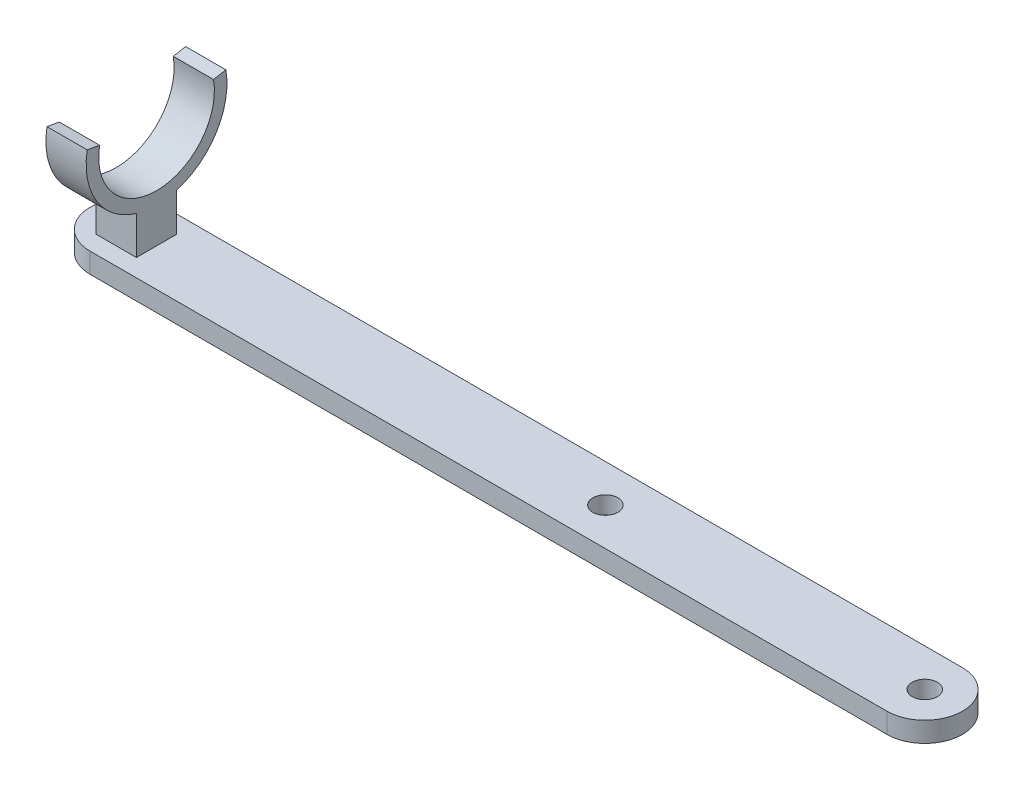
ISO-10303-21;
HEADER;
FILE_DESCRIPTION(('STEP AP214'),'2;1');
FILE_NAME('part.step','',(''),(''),'','','');
FILE_SCHEMA(('AUTOMOTIVE_DESIGN { 1 0 10303 214 1 1 1 1 }'));
ENDSEC;
DATA;
#1=APPLICATION_CONTEXT('core data for automotive mechanical design processes');
#2=APPLICATION_PROTOCOL_DEFINITION('international standard','automotive_design',2000,#1);
#3=PRODUCT_CONTEXT('',#1,'mechanical');
#4=PRODUCT('Part','Part','',(#3));
#5=PRODUCT_RELATED_PRODUCT_CATEGORY('part','',(#4));
#6=PRODUCT_DEFINITION_FORMATION('','',#4);
#7=PRODUCT_DEFINITION_CONTEXT('part definition',#1,'design');
#8=PRODUCT_DEFINITION('design','',#6,#7);
#9=PRODUCT_DEFINITION_SHAPE('','',#8);
#10=(LENGTH_UNIT() NAMED_UNIT(*) SI_UNIT(.MILLI.,.METRE.));
#11=(NAMED_UNIT(*) PLANE_ANGLE_UNIT() SI_UNIT($,.RADIAN.));
#12=(NAMED_UNIT(*) SI_UNIT($,.STERADIAN.) SOLID_ANGLE_UNIT());
#13=UNCERTAINTY_MEASURE_WITH_UNIT(LENGTH_MEASURE(1.E-05),#10,'distance_accuracy_value','');
#14=(GEOMETRIC_REPRESENTATION_CONTEXT(3) GLOBAL_UNCERTAINTY_ASSIGNED_CONTEXT((#13)) GLOBAL_UNIT_ASSIGNED_CONTEXT((#10,
#11,#12)) REPRESENTATION_CONTEXT('',''));
#15=CARTESIAN_POINT('',(0.,0.,0.));
#16=DIRECTION('',(0.,0.,1.));
#17=DIRECTION('',(1.,0.,0.));
#18=AXIS2_PLACEMENT_3D('',#15,#16,#17);
#19=CARTESIAN_POINT('',(-31.75,4.,0.));
#20=DIRECTION('',(0.,-1.,0.));
#21=DIRECTION('',(0.,0.,-1.));
#22=AXIS2_PLACEMENT_3D('',#19,#20,#21);
#23=CYLINDRICAL_SURFACE('',#22,2.5);
#24=CARTESIAN_POINT('',(-31.75,4.,0.));
#25=DIRECTION('',(0.,1.,0.));
#26=DIRECTION('',(0.,0.,1.));
#27=AXIS2_PLACEMENT_3D('',#24,#25,#26);
#28=CIRCLE('',#27,2.5);
#29=CARTESIAN_POINT('',(-31.75,4.,2.5));
#30=VERTEX_POINT('',#29);
#31=EDGE_CURVE('E241',#30,#30,#28,.T.);
#32=ORIENTED_EDGE('',*,*,#31,.T.);
#33=EDGE_LOOP('',(#32));
#34=FACE_BOUND('',#33,.T.);
#35=CARTESIAN_POINT('',(-31.75,0.5,0.));
#36=DIRECTION('',(0.,-1.,0.));
#37=DIRECTION('',(0.,0.,-1.));
#38=AXIS2_PLACEMENT_3D('',#35,#36,#37);
#39=CIRCLE('',#38,2.5);
#40=CARTESIAN_POINT('',(-31.75,0.5,-2.5));
#41=VERTEX_POINT('',#40);
#42=EDGE_CURVE('E43',#41,#41,#39,.T.);
#43=ORIENTED_EDGE('',*,*,#42,.T.);
#44=EDGE_LOOP('',(#43));
#45=FACE_BOUND('',#44,.T.);
#46=ADVANCED_FACE('F39',(#34,#45),#23,.F.);
#47=CARTESIAN_POINT('',(31.75,4.,0.));
#48=DIRECTION('',(0.,-1.,0.));
#49=DIRECTION('',(0.,0.,-1.));
#50=AXIS2_PLACEMENT_3D('',#47,#48,#49);
#51=CYLINDRICAL_SURFACE('',#50,2.5);
#52=CARTESIAN_POINT('',(31.75,4.,0.));
#53=DIRECTION('',(0.,1.,0.));
#54=DIRECTION('',(0.,0.,1.));
#55=AXIS2_PLACEMENT_3D('',#52,#53,#54);
#56=CIRCLE('',#55,2.5);
#57=CARTESIAN_POINT('',(31.75,4.,2.49999999999999));
#58=VERTEX_POINT('',#57);
#59=EDGE_CURVE('E208',#58,#58,#56,.T.);
#60=ORIENTED_EDGE('',*,*,#59,.T.);
#61=EDGE_LOOP('',(#60));
#62=FACE_BOUND('',#61,.T.);
#63=CARTESIAN_POINT('',(31.75,0.5,0.));
#64=DIRECTION('',(0.,-1.,0.));
#65=DIRECTION('',(0.,0.,-1.));
#66=AXIS2_PLACEMENT_3D('',#63,#64,#65);
#67=CIRCLE('',#66,2.5);
#68=CARTESIAN_POINT('',(31.75,0.5,-2.50000000000001));
#69=VERTEX_POINT('',#68);
#70=EDGE_CURVE('E172',#69,#69,#67,.T.);
#71=ORIENTED_EDGE('',*,*,#70,.T.);
#72=EDGE_LOOP('',(#71));
#73=FACE_BOUND('',#72,.T.);
#74=ADVANCED_FACE('F324',(#62,#73),#51,.F.);
#75=CARTESIAN_POINT('',(-126.75,4.,0.));
#76=DIRECTION('',(0.,1.,0.));
#77=DIRECTION('',(0.,0.,1.));
#78=AXIS2_PLACEMENT_3D('',#75,#76,#77);
#79=PLANE('',#78);
#80=ORIENTED_EDGE('',*,*,#31,.F.);
#81=EDGE_LOOP('',(#80));
#82=FACE_BOUND('',#81,.T.);
#83=CARTESIAN_POINT('',(-126.75,4.,0.));
#84=DIRECTION('',(0.,1.,0.));
#85=DIRECTION('',(0.,0.,1.));
#86=AXIS2_PLACEMENT_3D('',#83,#84,#85);
#87=CIRCLE('',#86,7.5);
#88=CARTESIAN_POINT('',(-126.75,4.,-7.49999999999999));
#89=VERTEX_POINT('',#88);
#90=CARTESIAN_POINT('',(-126.75,4.,7.50000000000001));
#91=VERTEX_POINT('',#90);
#92=EDGE_CURVE('E246',#89,#91,#87,.T.);
#93=ORIENTED_EDGE('',*,*,#92,.T.);
#94=DIRECTION('',(1.,0.,0.));
#95=VECTOR('',#94,1.);
#96=CARTESIAN_POINT('',(-126.75,4.,7.50000000000001));
#97=LINE('',#96,#95);
#98=CARTESIAN_POINT('',(31.75,4.,7.49999999999999));
#99=VERTEX_POINT('',#98);
#100=EDGE_CURVE('E94',#91,#99,#97,.T.);
#101=ORIENTED_EDGE('',*,*,#100,.T.);
#102=CARTESIAN_POINT('',(31.75,4.,0.));
#103=DIRECTION('',(0.,1.,0.));
#104=DIRECTION('',(0.,0.,1.));
#105=AXIS2_PLACEMENT_3D('',#102,#103,#104);
#106=CIRCLE('',#105,7.5);
#107=CARTESIAN_POINT('',(31.75,4.,-7.49999999999999));
#108=VERTEX_POINT('',#107);
#109=EDGE_CURVE('E251',#99,#108,#106,.T.);
#110=ORIENTED_EDGE('',*,*,#109,.T.);
#111=DIRECTION('',(-1.,0.,0.));
#112=VECTOR('',#111,1.);
#113=CARTESIAN_POINT('',(-126.75,4.,-7.49999999999999));
#114=LINE('',#113,#112);
#115=EDGE_CURVE('E66',#108,#89,#114,.T.);
#116=ORIENTED_EDGE('',*,*,#115,.T.);
#117=EDGE_LOOP('',(#93,#101,#110,#116));
#118=FACE_BOUND('',#117,.T.);
#119=ORIENTED_EDGE('',*,*,#59,.F.);
#120=EDGE_LOOP('',(#119));
#121=FACE_BOUND('',#120,.T.);
#122=DIRECTION('',(0.,0.,1.));
#123=VECTOR('',#122,1.);
#124=CARTESIAN_POINT('',(-129.,4.,4.00000000000001));
#125=LINE('',#124,#123);
#126=CARTESIAN_POINT('',(-129.,4.,-3.99999999999999));
#127=VERTEX_POINT('',#126);
#128=CARTESIAN_POINT('',(-129.,4.,4.00000000000001));
#129=VERTEX_POINT('',#128);
#130=EDGE_CURVE('E197',#127,#129,#125,.T.);
#131=ORIENTED_EDGE('',*,*,#130,.F.);
#132=DIRECTION('',(-1.,0.,0.));
#133=VECTOR('',#132,1.);
#134=CARTESIAN_POINT('',(-129.,4.,-3.99999999999999));
#135=LINE('',#134,#133);
#136=CARTESIAN_POINT('',(-121.,4.,-3.99999999999999));
#137=VERTEX_POINT('',#136);
#138=EDGE_CURVE('E57',#137,#127,#135,.T.);
#139=ORIENTED_EDGE('',*,*,#138,.F.);
#140=DIRECTION('',(0.,0.,-1.));
#141=VECTOR('',#140,1.);
#142=CARTESIAN_POINT('',(-121.,4.,4.00000000000001));
#143=LINE('',#142,#141);
#144=CARTESIAN_POINT('',(-121.,4.,4.00000000000001));
#145=VERTEX_POINT('',#144);
#146=EDGE_CURVE('E217',#145,#137,#143,.T.);
#147=ORIENTED_EDGE('',*,*,#146,.F.);
#148=DIRECTION('',(1.,0.,0.));
#149=VECTOR('',#148,1.);
#150=CARTESIAN_POINT('',(-129.,4.,4.00000000000001));
#151=LINE('',#150,#149);
#152=EDGE_CURVE('E213',#129,#145,#151,.T.);
#153=ORIENTED_EDGE('',*,*,#152,.F.);
#154=EDGE_LOOP('',(#131,#139,#147,#153));
#155=FACE_BOUND('',#154,.T.);
#156=ADVANCED_FACE('F303',(#82,#118,#121,#155),#79,.T.);
#157=CARTESIAN_POINT('',(-126.75,0.,0.));
#158=DIRECTION('',(0.,1.,0.));
#159=DIRECTION('',(0.,0.,1.));
#160=AXIS2_PLACEMENT_3D('',#157,#158,#159);
#161=PLANE('',#160);
#162=CARTESIAN_POINT('',(-31.75,0.,0.));
#163=DIRECTION('',(0.,-1.,0.));
#164=DIRECTION('',(0.,0.,-1.));
#165=AXIS2_PLACEMENT_3D('',#162,#163,#164);
#166=CIRCLE('',#165,5.4);
#167=CARTESIAN_POINT('',(-31.75,0.,-5.4));
#168=VERTEX_POINT('',#167);
#169=EDGE_CURVE('E282',#168,#168,#166,.T.);
#170=ORIENTED_EDGE('',*,*,#169,.F.);
#171=EDGE_LOOP('',(#170));
#172=FACE_BOUND('',#171,.T.);
#173=CARTESIAN_POINT('',(31.75,0.,0.));
#174=DIRECTION('',(0.,-1.,0.));
#175=DIRECTION('',(0.,0.,-1.));
#176=AXIS2_PLACEMENT_3D('',#173,#174,#175);
#177=CIRCLE('',#176,5.4);
#178=CARTESIAN_POINT('',(31.75,0.,-5.40000000000001));
#179=VERTEX_POINT('',#178);
#180=EDGE_CURVE('E174',#179,#179,#177,.T.);
#181=ORIENTED_EDGE('',*,*,#180,.F.);
#182=EDGE_LOOP('',(#181));
#183=FACE_BOUND('',#182,.T.);
#184=CARTESIAN_POINT('',(-126.75,0.,0.));
#185=DIRECTION('',(0.,1.,0.));
#186=DIRECTION('',(0.,0.,1.));
#187=AXIS2_PLACEMENT_3D('',#184,#185,#186);
#188=CIRCLE('',#187,7.5);
#189=CARTESIAN_POINT('',(-126.75,0.,-7.49999999999999));
#190=VERTEX_POINT('',#189);
#191=CARTESIAN_POINT('',(-126.75,0.,7.50000000000001));
#192=VERTEX_POINT('',#191);
#193=EDGE_CURVE('E245',#190,#192,#188,.T.);
#194=ORIENTED_EDGE('',*,*,#193,.F.);
#195=DIRECTION('',(-1.,0.,0.));
#196=VECTOR('',#195,1.);
#197=CARTESIAN_POINT('',(-126.75,0.,-7.49999999999999));
#198=LINE('',#197,#196);
#199=CARTESIAN_POINT('',(31.75,0.,-7.49999999999999));
#200=VERTEX_POINT('',#199);
#201=EDGE_CURVE('E87',#200,#190,#198,.T.);
#202=ORIENTED_EDGE('',*,*,#201,.F.);
#203=CARTESIAN_POINT('',(31.75,0.,0.));
#204=DIRECTION('',(0.,1.,0.));
#205=DIRECTION('',(0.,0.,1.));
#206=AXIS2_PLACEMENT_3D('',#203,#204,#205);
#207=CIRCLE('',#206,7.5);
#208=CARTESIAN_POINT('',(31.75,0.,7.49999999999999));
#209=VERTEX_POINT('',#208);
#210=EDGE_CURVE('E263',#209,#200,#207,.T.);
#211=ORIENTED_EDGE('',*,*,#210,.F.);
#212=DIRECTION('',(1.,0.,0.));
#213=VECTOR('',#212,1.);
#214=CARTESIAN_POINT('',(-126.75,0.,7.50000000000001));
#215=LINE('',#214,#213);
#216=EDGE_CURVE('E260',#192,#209,#215,.T.);
#217=ORIENTED_EDGE('',*,*,#216,.F.);
#218=EDGE_LOOP('',(#194,#202,#211,#217));
#219=FACE_BOUND('',#218,.T.);
#220=ADVANCED_FACE('F300',(#172,#183,#219),#161,.F.);
#221=CARTESIAN_POINT('',(-126.75,4.,0.));
#222=DIRECTION('',(0.,-1.,0.));
#223=DIRECTION('',(0.,0.,-1.));
#224=AXIS2_PLACEMENT_3D('',#221,#222,#223);
#225=CYLINDRICAL_SURFACE('',#224,7.5);
#226=ORIENTED_EDGE('',*,*,#193,.T.);
#227=DIRECTION('',(0.,-1.,0.));
#228=VECTOR('',#227,1.);
#229=CARTESIAN_POINT('',(-126.75,4.,7.50000000000001));
#230=LINE('',#229,#228);
#231=EDGE_CURVE('E11',#91,#192,#230,.T.);
#232=ORIENTED_EDGE('',*,*,#231,.F.);
#233=ORIENTED_EDGE('',*,*,#92,.F.);
#234=DIRECTION('',(0.,-1.,0.));
#235=VECTOR('',#234,1.);
#236=CARTESIAN_POINT('',(-126.75,4.,-7.49999999999999));
#237=LINE('',#236,#235);
#238=EDGE_CURVE('E256',#89,#190,#237,.T.);
#239=ORIENTED_EDGE('',*,*,#238,.T.);
#240=EDGE_LOOP('',(#226,#232,#233,#239));
#241=FACE_BOUND('',#240,.T.);
#242=ADVANCED_FACE('F41',(#241),#225,.T.);
#243=CARTESIAN_POINT('',(-126.75,4.,7.50000000000001));
#244=DIRECTION('',(0.,0.,-1.));
#245=DIRECTION('',(-1.,0.,0.));
#246=AXIS2_PLACEMENT_3D('',#243,#244,#245);
#247=PLANE('',#246);
#248=ORIENTED_EDGE('',*,*,#216,.T.);
#249=DIRECTION('',(0.,-1.,0.));
#250=VECTOR('',#249,1.);
#251=CARTESIAN_POINT('',(31.75,4.,7.49999999999999));
#252=LINE('',#251,#250);
#253=EDGE_CURVE('E49',#99,#209,#252,.T.);
#254=ORIENTED_EDGE('',*,*,#253,.F.);
#255=ORIENTED_EDGE('',*,*,#100,.F.);
#256=ORIENTED_EDGE('',*,*,#231,.T.);
#257=EDGE_LOOP('',(#248,#254,#255,#256));
#258=FACE_BOUND('',#257,.T.);
#259=ADVANCED_FACE('F316',(#258),#247,.F.);
#260=CARTESIAN_POINT('',(31.75,4.,0.));
#261=DIRECTION('',(0.,-1.,0.));
#262=DIRECTION('',(0.,0.,-1.));
#263=AXIS2_PLACEMENT_3D('',#260,#261,#262);
#264=CYLINDRICAL_SURFACE('',#263,7.5);
#265=ORIENTED_EDGE('',*,*,#210,.T.);
#266=DIRECTION('',(0.,-1.,0.));
#267=VECTOR('',#266,1.);
#268=CARTESIAN_POINT('',(31.75,4.,-7.49999999999999));
#269=LINE('',#268,#267);
#270=EDGE_CURVE('E270',#108,#200,#269,.T.);
#271=ORIENTED_EDGE('',*,*,#270,.F.);
#272=ORIENTED_EDGE('',*,*,#109,.F.);
#273=ORIENTED_EDGE('',*,*,#253,.T.);
#274=EDGE_LOOP('',(#265,#271,#272,#273));
#275=FACE_BOUND('',#274,.T.);
#276=ADVANCED_FACE('F315',(#275),#264,.T.);
#277=CARTESIAN_POINT('',(-126.75,4.,-7.49999999999999));
#278=DIRECTION('',(0.,0.,1.));
#279=DIRECTION('',(1.,0.,0.));
#280=AXIS2_PLACEMENT_3D('',#277,#278,#279);
#281=PLANE('',#280);
#282=ORIENTED_EDGE('',*,*,#201,.T.);
#283=ORIENTED_EDGE('',*,*,#238,.F.);
#284=ORIENTED_EDGE('',*,*,#115,.F.);
#285=ORIENTED_EDGE('',*,*,#270,.T.);
#286=EDGE_LOOP('',(#282,#283,#284,#285));
#287=FACE_BOUND('',#286,.T.);
#288=ADVANCED_FACE('F311',(#287),#281,.F.);
#289=CARTESIAN_POINT('',(-129.,27.4320744873371,-3.99999999999999));
#290=DIRECTION('',(0.,0.,1.));
#291=DIRECTION('',(1.,0.,0.));
#292=AXIS2_PLACEMENT_3D('',#289,#290,#291);
#293=PLANE('',#292);
#294=DIRECTION('',(0.,-1.,0.));
#295=VECTOR('',#294,1.);
#296=CARTESIAN_POINT('',(-129.,27.4320744873371,-3.99999999999999));
#297=LINE('',#296,#295);
#298=CARTESIAN_POINT('',(-129.,11.5835921350013,-3.99999999999999));
#299=VERTEX_POINT('',#298);
#300=EDGE_CURVE('E223',#299,#127,#297,.T.);
#301=ORIENTED_EDGE('',*,*,#300,.F.);
#302=DIRECTION('',(1.,0.,0.));
#303=VECTOR('',#302,1.);
#304=CARTESIAN_POINT('',(-129.,11.5835921350013,-3.99999999999999));
#305=LINE('',#304,#303);
#306=CARTESIAN_POINT('',(-121.,11.5835921350013,-3.99999999999999));
#307=VERTEX_POINT('',#306);
#308=EDGE_CURVE('E209',#299,#307,#305,.T.);
#309=ORIENTED_EDGE('',*,*,#308,.T.);
#310=DIRECTION('',(0.,-1.,0.));
#311=VECTOR('',#310,1.);
#312=CARTESIAN_POINT('',(-121.,27.4320744873371,-3.99999999999999));
#313=LINE('',#312,#311);
#314=EDGE_CURVE('E226',#307,#137,#313,.T.);
#315=ORIENTED_EDGE('',*,*,#314,.T.);
#316=ORIENTED_EDGE('',*,*,#138,.T.);
#317=EDGE_LOOP('',(#301,#309,#315,#316));
#318=FACE_BOUND('',#317,.T.);
#319=ADVANCED_FACE('F339',(#318),#293,.F.);
#320=CARTESIAN_POINT('',(-121.,27.4320744873371,4.00000000000001));
#321=DIRECTION('',(-1.,0.,0.));
#322=DIRECTION('',(0.,0.,1.));
#323=AXIS2_PLACEMENT_3D('',#320,#321,#322);
#324=PLANE('',#323);
#325=ORIENTED_EDGE('',*,*,#314,.F.);
#326=CARTESIAN_POINT('',(-121.,25.,0.));
#327=DIRECTION('',(1.,0.,0.));
#328=DIRECTION('',(0.,0.,1.));
#329=AXIS2_PLACEMENT_3D('',#326,#327,#328);
#330=CIRCLE('',#329,14.);
#331=CARTESIAN_POINT('',(-121.,27.4310744873371,-13.7873085421709));
#332=VERTEX_POINT('',#331);
#333=EDGE_CURVE('E161',#307,#332,#330,.T.);
#334=ORIENTED_EDGE('',*,*,#333,.T.);
#335=DIRECTION('',(0.,-0.173648177666931,0.984807753012208));
#336=VECTOR('',#335,1.);
#337=CARTESIAN_POINT('',(-121.,26.9969540431697,-11.3252891596404));
#338=LINE('',#337,#336);
#339=CARTESIAN_POINT('',(-121.,26.9969540431697,-11.3252891596404));
#340=VERTEX_POINT('',#339);
#341=EDGE_CURVE('E167',#332,#340,#338,.T.);
#342=ORIENTED_EDGE('',*,*,#341,.T.);
#343=CARTESIAN_POINT('',(-121.,25.,0.));
#344=DIRECTION('',(-1.,0.,0.));
#345=DIRECTION('',(0.,0.,1.));
#346=AXIS2_PLACEMENT_3D('',#343,#344,#345);
#347=CIRCLE('',#346,11.5);
#348=CARTESIAN_POINT('',(-121.,26.9969540431697,11.3252891596404));
#349=VERTEX_POINT('',#348);
#350=EDGE_CURVE('E145',#340,#349,#347,.T.);
#351=ORIENTED_EDGE('',*,*,#350,.T.);
#352=DIRECTION('',(0.,0.173648177666932,0.984807753012208));
#353=VECTOR('',#352,1.);
#354=CARTESIAN_POINT('',(-121.,27.4310744873371,13.7873085421709));
#355=LINE('',#354,#353);
#356=CARTESIAN_POINT('',(-121.,27.4310744873371,13.7873085421709));
#357=VERTEX_POINT('',#356);
#358=EDGE_CURVE('E156',#349,#357,#355,.T.);
#359=ORIENTED_EDGE('',*,*,#358,.T.);
#360=CARTESIAN_POINT('',(-121.,11.5835921350013,4.00000000000001));
#361=VERTEX_POINT('',#360);
#362=EDGE_CURVE('E177',#357,#361,#330,.T.);
#363=ORIENTED_EDGE('',*,*,#362,.T.);
#364=DIRECTION('',(0.,-1.,0.));
#365=VECTOR('',#364,1.);
#366=CARTESIAN_POINT('',(-121.,27.4320744873371,4.00000000000001));
#367=LINE('',#366,#365);
#368=EDGE_CURVE('E229',#361,#145,#367,.T.);
#369=ORIENTED_EDGE('',*,*,#368,.T.);
#370=ORIENTED_EDGE('',*,*,#146,.T.);
#371=EDGE_LOOP('',(#325,#334,#342,#351,#359,#363,#369,#370));
#372=FACE_BOUND('',#371,.T.);
#373=ADVANCED_FACE('F165',(#372),#324,.F.);
#374=CARTESIAN_POINT('',(-129.,27.4320744873371,4.00000000000001));
#375=DIRECTION('',(0.,0.,-1.));
#376=DIRECTION('',(-1.,0.,0.));
#377=AXIS2_PLACEMENT_3D('',#374,#375,#376);
#378=PLANE('',#377);
#379=ORIENTED_EDGE('',*,*,#368,.F.);
#380=DIRECTION('',(1.,0.,0.));
#381=VECTOR('',#380,1.);
#382=CARTESIAN_POINT('',(-129.,11.5835921350013,4.00000000000001));
#383=LINE('',#382,#381);
#384=CARTESIAN_POINT('',(-129.,11.5835921350013,4.00000000000001));
#385=VERTEX_POINT('',#384);
#386=EDGE_CURVE('E204',#361,#385,#383,.F.);
#387=ORIENTED_EDGE('',*,*,#386,.T.);
#388=DIRECTION('',(0.,-1.,0.));
#389=VECTOR('',#388,1.);
#390=CARTESIAN_POINT('',(-129.,27.4320744873371,4.00000000000001));
#391=LINE('',#390,#389);
#392=EDGE_CURVE('E232',#385,#129,#391,.T.);
#393=ORIENTED_EDGE('',*,*,#392,.T.);
#394=ORIENTED_EDGE('',*,*,#152,.T.);
#395=EDGE_LOOP('',(#379,#387,#393,#394));
#396=FACE_BOUND('',#395,.T.);
#397=ADVANCED_FACE('F347',(#396),#378,.F.);
#398=CARTESIAN_POINT('',(-129.,27.4320744873371,4.00000000000001));
#399=DIRECTION('',(1.,0.,0.));
#400=DIRECTION('',(0.,0.,-1.));
#401=AXIS2_PLACEMENT_3D('',#398,#399,#400);
#402=PLANE('',#401);
#403=ORIENTED_EDGE('',*,*,#392,.F.);
#404=CARTESIAN_POINT('',(-129.,25.,0.));
#405=DIRECTION('',(1.,0.,0.));
#406=DIRECTION('',(0.,0.,1.));
#407=AXIS2_PLACEMENT_3D('',#404,#405,#406);
#408=CIRCLE('',#407,14.);
#409=CARTESIAN_POINT('',(-129.,27.4310744873371,13.7873085421709));
#410=VERTEX_POINT('',#409);
#411=EDGE_CURVE('E188',#410,#385,#408,.T.);
#412=ORIENTED_EDGE('',*,*,#411,.F.);
#413=DIRECTION('',(0.,0.173648177666932,0.984807753012208));
#414=VECTOR('',#413,1.);
#415=CARTESIAN_POINT('',(-129.,27.4310744873371,13.7873085421709));
#416=LINE('',#415,#414);
#417=CARTESIAN_POINT('',(-129.,26.9969540431697,11.3252891596404));
#418=VERTEX_POINT('',#417);
#419=EDGE_CURVE('E184',#418,#410,#416,.T.);
#420=ORIENTED_EDGE('',*,*,#419,.F.);
#421=CARTESIAN_POINT('',(-129.,25.,0.));
#422=DIRECTION('',(-1.,0.,0.));
#423=DIRECTION('',(0.,0.,1.));
#424=AXIS2_PLACEMENT_3D('',#421,#422,#423);
#425=CIRCLE('',#424,11.5);
#426=CARTESIAN_POINT('',(-129.,26.9969540431697,-11.3252891596404));
#427=VERTEX_POINT('',#426);
#428=EDGE_CURVE('E147',#427,#418,#425,.T.);
#429=ORIENTED_EDGE('',*,*,#428,.F.);
#430=DIRECTION('',(0.,-0.173648177666931,0.984807753012208));
#431=VECTOR('',#430,1.);
#432=CARTESIAN_POINT('',(-129.,26.9969540431697,-11.3252891596404));
#433=LINE('',#432,#431);
#434=CARTESIAN_POINT('',(-129.,27.4310744873371,-13.7873085421709));
#435=VERTEX_POINT('',#434);
#436=EDGE_CURVE('E153',#435,#427,#433,.T.);
#437=ORIENTED_EDGE('',*,*,#436,.F.);
#438=EDGE_CURVE('E187',#299,#435,#408,.T.);
#439=ORIENTED_EDGE('',*,*,#438,.F.);
#440=ORIENTED_EDGE('',*,*,#300,.T.);
#441=ORIENTED_EDGE('',*,*,#130,.T.);
#442=EDGE_LOOP('',(#403,#412,#420,#429,#437,#439,#440,#441));
#443=FACE_BOUND('',#442,.T.);
#444=ADVANCED_FACE('F353',(#443),#402,.F.);
#445=CARTESIAN_POINT('',(-129.,25.,0.));
#446=DIRECTION('',(1.,0.,0.));
#447=DIRECTION('',(0.,0.,-1.));
#448=AXIS2_PLACEMENT_3D('',#445,#446,#447);
#449=CYLINDRICAL_SURFACE('',#448,14.);
#450=ORIENTED_EDGE('',*,*,#308,.F.);
#451=ORIENTED_EDGE('',*,*,#438,.T.);
#452=DIRECTION('',(1.,0.,0.));
#453=VECTOR('',#452,1.);
#454=CARTESIAN_POINT('',(-129.,27.4310744873371,-13.7873085421709));
#455=LINE('',#454,#453);
#456=EDGE_CURVE('E198',#435,#332,#455,.T.);
#457=ORIENTED_EDGE('',*,*,#456,.T.);
#458=ORIENTED_EDGE('',*,*,#333,.F.);
#459=EDGE_LOOP('',(#450,#451,#457,#458));
#460=FACE_BOUND('',#459,.T.);
#461=ADVANCED_FACE('F356',(#460),#449,.T.);
#462=ORIENTED_EDGE('',*,*,#386,.F.);
#463=ORIENTED_EDGE('',*,*,#362,.F.);
#464=DIRECTION('',(1.,0.,0.));
#465=VECTOR('',#464,1.);
#466=CARTESIAN_POINT('',(-129.,27.4310744873371,13.7873085421709));
#467=LINE('',#466,#465);
#468=EDGE_CURVE('E152',#410,#357,#467,.T.);
#469=ORIENTED_EDGE('',*,*,#468,.F.);
#470=ORIENTED_EDGE('',*,*,#411,.T.);
#471=EDGE_LOOP('',(#462,#463,#469,#470));
#472=FACE_BOUND('',#471,.T.);
#473=ADVANCED_FACE('F361',(#472),#449,.T.);
#474=CARTESIAN_POINT('',(-129.,25.,0.));
#475=DIRECTION('',(1.,0.,0.));
#476=DIRECTION('',(0.,0.,-1.));
#477=AXIS2_PLACEMENT_3D('',#474,#475,#476);
#478=CYLINDRICAL_SURFACE('',#477,11.5);
#479=DIRECTION('',(1.,0.,0.));
#480=VECTOR('',#479,1.);
#481=CARTESIAN_POINT('',(-129.,26.9969540431697,11.3252891596404));
#482=LINE('',#481,#480);
#483=EDGE_CURVE('E141',#418,#349,#482,.T.);
#484=ORIENTED_EDGE('',*,*,#483,.T.);
#485=ORIENTED_EDGE('',*,*,#350,.F.);
#486=DIRECTION('',(1.,0.,0.));
#487=VECTOR('',#486,1.);
#488=CARTESIAN_POINT('',(-129.,26.9969540431697,-11.3252891596404));
#489=LINE('',#488,#487);
#490=EDGE_CURVE('E194',#427,#340,#489,.T.);
#491=ORIENTED_EDGE('',*,*,#490,.F.);
#492=ORIENTED_EDGE('',*,*,#428,.T.);
#493=EDGE_LOOP('',(#484,#485,#491,#492));
#494=FACE_BOUND('',#493,.T.);
#495=ADVANCED_FACE('F143',(#494),#478,.F.);
#496=CARTESIAN_POINT('',(-129.,26.9969540431697,-11.3252891596404));
#497=DIRECTION('',(0.,0.984807753012208,0.173648177666931));
#498=DIRECTION('',(0.,-0.173648177666931,0.984807753012208));
#499=AXIS2_PLACEMENT_3D('',#496,#497,#498);
#500=PLANE('',#499);
#501=ORIENTED_EDGE('',*,*,#490,.T.);
#502=ORIENTED_EDGE('',*,*,#341,.F.);
#503=ORIENTED_EDGE('',*,*,#456,.F.);
#504=ORIENTED_EDGE('',*,*,#436,.T.);
#505=EDGE_LOOP('',(#501,#502,#503,#504));
#506=FACE_BOUND('',#505,.T.);
#507=ADVANCED_FACE('F379',(#506),#500,.T.);
#508=CARTESIAN_POINT('',(-129.,27.4310744873371,13.7873085421709));
#509=DIRECTION('',(0.,0.984807753012208,-0.173648177666932));
#510=DIRECTION('',(0.,0.173648177666932,0.984807753012208));
#511=AXIS2_PLACEMENT_3D('',#508,#509,#510);
#512=PLANE('',#511);
#513=ORIENTED_EDGE('',*,*,#468,.T.);
#514=ORIENTED_EDGE('',*,*,#358,.F.);
#515=ORIENTED_EDGE('',*,*,#483,.F.);
#516=ORIENTED_EDGE('',*,*,#419,.T.);
#517=EDGE_LOOP('',(#513,#514,#515,#516));
#518=FACE_BOUND('',#517,.T.);
#519=ADVANCED_FACE('F157',(#518),#512,.T.);
#520=CARTESIAN_POINT('',(31.75,0.5,0.));
#521=DIRECTION('',(0.,-1.,0.));
#522=DIRECTION('',(0.,0.,-1.));
#523=AXIS2_PLACEMENT_3D('',#520,#521,#522);
#524=CYLINDRICAL_SURFACE('',#523,5.4);
#525=CARTESIAN_POINT('',(31.75,0.5,0.));
#526=DIRECTION('',(0.,-1.,0.));
#527=DIRECTION('',(0.,0.,-1.));
#528=AXIS2_PLACEMENT_3D('',#525,#526,#527);
#529=CIRCLE('',#528,5.4);
#530=CARTESIAN_POINT('',(31.75,0.5,-5.40000000000001));
#531=VERTEX_POINT('',#530);
#532=EDGE_CURVE('E288',#531,#531,#529,.T.);
#533=ORIENTED_EDGE('',*,*,#532,.F.);
#534=EDGE_LOOP('',(#533));
#535=FACE_BOUND('',#534,.T.);
#536=ORIENTED_EDGE('',*,*,#180,.T.);
#537=EDGE_LOOP('',(#536));
#538=FACE_BOUND('',#537,.T.);
#539=ADVANCED_FACE('F298',(#535,#538),#524,.F.);
#540=CARTESIAN_POINT('',(31.75,0.5,0.));
#541=DIRECTION('',(0.,-1.,0.));
#542=DIRECTION('',(0.,0.,-1.));
#543=AXIS2_PLACEMENT_3D('',#540,#541,#542);
#544=PLANE('',#543);
#545=ORIENTED_EDGE('',*,*,#70,.F.);
#546=EDGE_LOOP('',(#545));
#547=FACE_BOUND('',#546,.T.);
#548=ORIENTED_EDGE('',*,*,#532,.T.);
#549=EDGE_LOOP('',(#548));
#550=FACE_BOUND('',#549,.T.);
#551=ADVANCED_FACE('F389',(#547,#550),#544,.T.);
#552=CARTESIAN_POINT('',(-31.75,0.5,0.));
#553=DIRECTION('',(0.,-1.,0.));
#554=DIRECTION('',(0.,0.,-1.));
#555=AXIS2_PLACEMENT_3D('',#552,#553,#554);
#556=CYLINDRICAL_SURFACE('',#555,5.4);
#557=CARTESIAN_POINT('',(-31.75,0.5,0.));
#558=DIRECTION('',(0.,-1.,0.));
#559=DIRECTION('',(0.,0.,-1.));
#560=AXIS2_PLACEMENT_3D('',#557,#558,#559);
#561=CIRCLE('',#560,5.4);
#562=CARTESIAN_POINT('',(-31.75,0.5,-5.4));
#563=VERTEX_POINT('',#562);
#564=EDGE_CURVE('E277',#563,#563,#561,.T.);
#565=ORIENTED_EDGE('',*,*,#564,.F.);
#566=EDGE_LOOP('',(#565));
#567=FACE_BOUND('',#566,.T.);
#568=ORIENTED_EDGE('',*,*,#169,.T.);
#569=EDGE_LOOP('',(#568));
#570=FACE_BOUND('',#569,.T.);
#571=ADVANCED_FACE('F393',(#567,#570),#556,.F.);
#572=CARTESIAN_POINT('',(-31.75,0.5,0.));
#573=DIRECTION('',(0.,-1.,0.));
#574=DIRECTION('',(0.,0.,-1.));
#575=AXIS2_PLACEMENT_3D('',#572,#573,#574);
#576=PLANE('',#575);
#577=ORIENTED_EDGE('',*,*,#42,.F.);
#578=EDGE_LOOP('',(#577));
#579=FACE_BOUND('',#578,.T.);
#580=ORIENTED_EDGE('',*,*,#564,.T.);
#581=EDGE_LOOP('',(#580));
#582=FACE_BOUND('',#581,.T.);
#583=ADVANCED_FACE('F397',(#579,#582),#576,.T.);
#584=CLOSED_SHELL('',(#46,#74,#156,#220,#242,#259,#276,#288,#319,#373,#397,#444,#461,#473,#495,
#507,#519,#539,#551,#571,#583));
#585=MANIFOLD_SOLID_BREP('B2',#584);
#586=ADVANCED_BREP_SHAPE_REPRESENTATION('',(#18,#585),#14);
#587=SHAPE_DEFINITION_REPRESENTATION(#9,#586);
ENDSEC;
END-ISO-10303-21;
